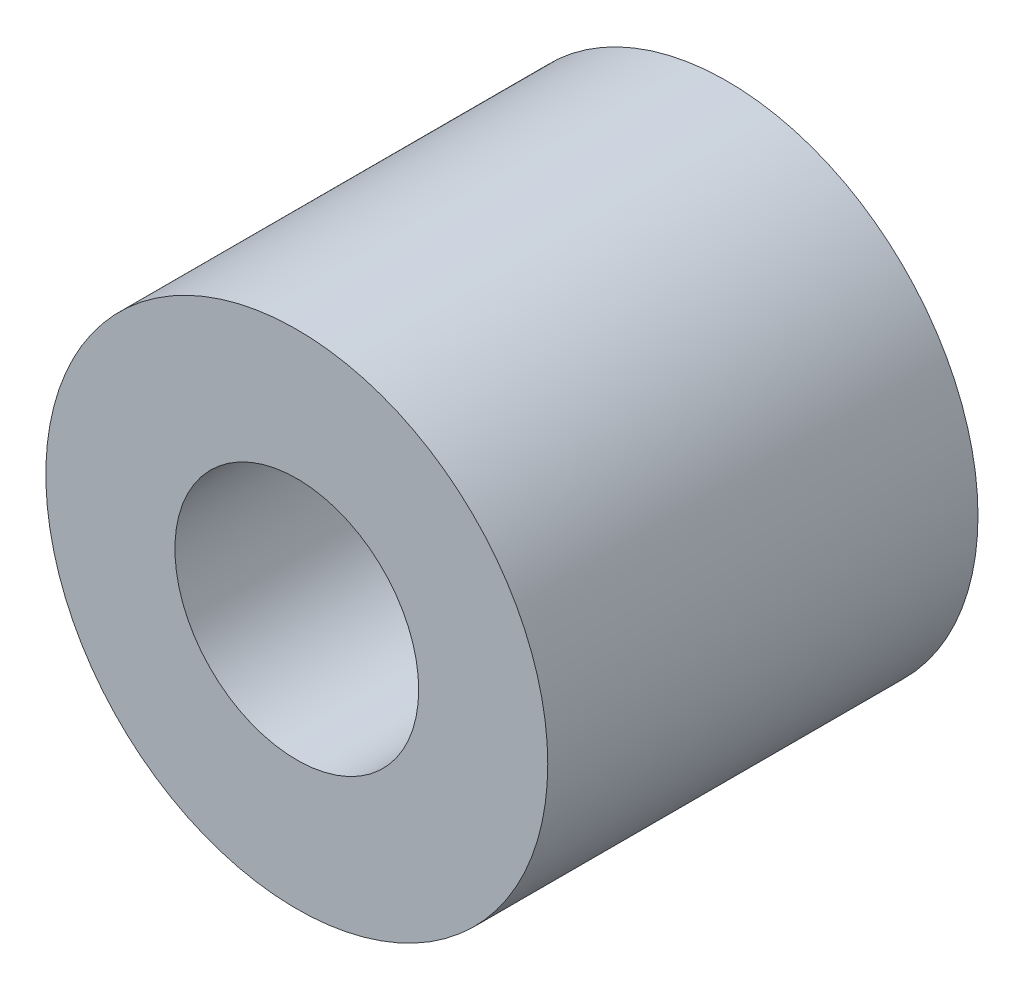
ISO-10303-21;
HEADER;
FILE_DESCRIPTION(('STEP AP214'),'2;1');
FILE_NAME('part.step','',(''),(''),'','','');
FILE_SCHEMA(('AUTOMOTIVE_DESIGN { 1 0 10303 214 1 1 1 1 }'));
ENDSEC;
DATA;
#1=APPLICATION_CONTEXT('core data for automotive mechanical design processes');
#2=APPLICATION_PROTOCOL_DEFINITION('international standard','automotive_design',2000,#1);
#3=PRODUCT_CONTEXT('',#1,'mechanical');
#4=PRODUCT('Part','Part','',(#3));
#5=PRODUCT_RELATED_PRODUCT_CATEGORY('part','',(#4));
#6=PRODUCT_DEFINITION_FORMATION('','',#4);
#7=PRODUCT_DEFINITION_CONTEXT('part definition',#1,'design');
#8=PRODUCT_DEFINITION('design','',#6,#7);
#9=PRODUCT_DEFINITION_SHAPE('','',#8);
#10=(LENGTH_UNIT() NAMED_UNIT(*) SI_UNIT(.MILLI.,.METRE.));
#11=(NAMED_UNIT(*) PLANE_ANGLE_UNIT() SI_UNIT($,.RADIAN.));
#12=(NAMED_UNIT(*) SI_UNIT($,.STERADIAN.) SOLID_ANGLE_UNIT());
#13=UNCERTAINTY_MEASURE_WITH_UNIT(LENGTH_MEASURE(1.E-05),#10,'distance_accuracy_value','');
#14=(GEOMETRIC_REPRESENTATION_CONTEXT(3) GLOBAL_UNCERTAINTY_ASSIGNED_CONTEXT((#13)) GLOBAL_UNIT_ASSIGNED_CONTEXT((#10,
#11,#12)) REPRESENTATION_CONTEXT('',''));
#15=CARTESIAN_POINT('',(0.,0.,0.));
#16=DIRECTION('',(0.,0.,1.));
#17=DIRECTION('',(1.,0.,0.));
#18=AXIS2_PLACEMENT_3D('',#15,#16,#17);
#19=CARTESIAN_POINT('',(0.,0.,6.));
#20=DIRECTION('',(0.,0.,1.));
#21=DIRECTION('',(1.,0.,0.));
#22=AXIS2_PLACEMENT_3D('',#19,#20,#21);
#23=PLANE('',#22);
#24=CARTESIAN_POINT('',(0.,0.,6.));
#25=DIRECTION('',(0.,0.,1.));
#26=DIRECTION('',(1.,0.,0.));
#27=AXIS2_PLACEMENT_3D('',#24,#25,#26);
#28=CIRCLE('',#27,3.5);
#29=CARTESIAN_POINT('',(3.5,0.,6.));
#30=VERTEX_POINT('',#29);
#31=EDGE_CURVE('E10',#30,#30,#28,.T.);
#32=ORIENTED_EDGE('',*,*,#31,.T.);
#33=EDGE_LOOP('',(#32));
#34=FACE_BOUND('',#33,.T.);
#35=CARTESIAN_POINT('',(0.,0.,6.));
#36=DIRECTION('',(0.,0.,1.));
#37=DIRECTION('',(1.,0.,0.));
#38=AXIS2_PLACEMENT_3D('',#35,#36,#37);
#39=CIRCLE('',#38,1.7);
#40=CARTESIAN_POINT('',(1.7,0.,6.));
#41=VERTEX_POINT('',#40);
#42=EDGE_CURVE('E46',#41,#41,#39,.T.);
#43=ORIENTED_EDGE('',*,*,#42,.F.);
#44=EDGE_LOOP('',(#43));
#45=FACE_BOUND('',#44,.T.);
#46=ADVANCED_FACE('F35',(#34,#45),#23,.T.);
#47=CARTESIAN_POINT('',(0.,0.,0.));
#48=DIRECTION('',(0.,0.,1.));
#49=DIRECTION('',(1.,0.,0.));
#50=AXIS2_PLACEMENT_3D('',#47,#48,#49);
#51=PLANE('',#50);
#52=CARTESIAN_POINT('',(0.,0.,0.));
#53=DIRECTION('',(0.,0.,1.));
#54=DIRECTION('',(1.,0.,0.));
#55=AXIS2_PLACEMENT_3D('',#52,#53,#54);
#56=CIRCLE('',#55,3.5);
#57=CARTESIAN_POINT('',(3.5,0.,0.));
#58=VERTEX_POINT('',#57);
#59=EDGE_CURVE('E39',#58,#58,#56,.T.);
#60=ORIENTED_EDGE('',*,*,#59,.F.);
#61=EDGE_LOOP('',(#60));
#62=FACE_BOUND('',#61,.T.);
#63=CARTESIAN_POINT('',(0.,0.,0.));
#64=DIRECTION('',(0.,0.,1.));
#65=DIRECTION('',(1.,0.,0.));
#66=AXIS2_PLACEMENT_3D('',#63,#64,#65);
#67=CIRCLE('',#66,1.7);
#68=CARTESIAN_POINT('',(1.7,0.,0.));
#69=VERTEX_POINT('',#68);
#70=EDGE_CURVE('E48',#69,#69,#67,.T.);
#71=ORIENTED_EDGE('',*,*,#70,.T.);
#72=EDGE_LOOP('',(#71));
#73=FACE_BOUND('',#72,.T.);
#74=ADVANCED_FACE('F58',(#62,#73),#51,.F.);
#75=CARTESIAN_POINT('',(0.,0.,6.));
#76=DIRECTION('',(0.,0.,-1.));
#77=DIRECTION('',(-1.,0.,0.));
#78=AXIS2_PLACEMENT_3D('',#75,#76,#77);
#79=CYLINDRICAL_SURFACE('',#78,3.5);
#80=ORIENTED_EDGE('',*,*,#31,.F.);
#81=EDGE_LOOP('',(#80));
#82=FACE_BOUND('',#81,.T.);
#83=ORIENTED_EDGE('',*,*,#59,.T.);
#84=EDGE_LOOP('',(#83));
#85=FACE_BOUND('',#84,.T.);
#86=ADVANCED_FACE('F37',(#82,#85),#79,.T.);
#87=CARTESIAN_POINT('',(0.,0.,6.));
#88=DIRECTION('',(0.,0.,-1.));
#89=DIRECTION('',(-1.,0.,0.));
#90=AXIS2_PLACEMENT_3D('',#87,#88,#89);
#91=CYLINDRICAL_SURFACE('',#90,1.7);
#92=ORIENTED_EDGE('',*,*,#42,.T.);
#93=EDGE_LOOP('',(#92));
#94=FACE_BOUND('',#93,.T.);
#95=ORIENTED_EDGE('',*,*,#70,.F.);
#96=EDGE_LOOP('',(#95));
#97=FACE_BOUND('',#96,.T.);
#98=ADVANCED_FACE('F54',(#94,#97),#91,.F.);
#99=CLOSED_SHELL('',(#46,#74,#86,#98));
#100=MANIFOLD_SOLID_BREP('B2',#99);
#101=ADVANCED_BREP_SHAPE_REPRESENTATION('',(#18,#100),#14);
#102=SHAPE_DEFINITION_REPRESENTATION(#9,#101);
ENDSEC;
END-ISO-10303-21;
